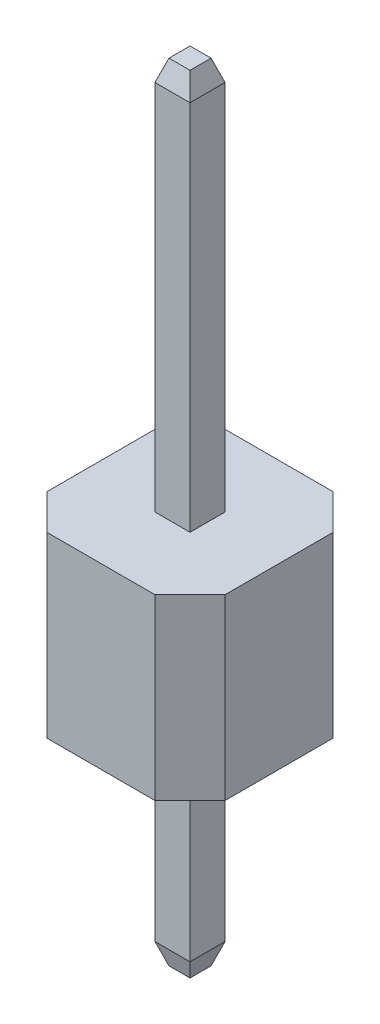
ISO-10303-21;
HEADER;
FILE_DESCRIPTION(('STEP AP214'),'2;1');
FILE_NAME('part.step','',(''),(''),'','','');
FILE_SCHEMA(('AUTOMOTIVE_DESIGN { 1 0 10303 214 1 1 1 1 }'));
ENDSEC;
DATA;
#1=APPLICATION_CONTEXT('core data for automotive mechanical design processes');
#2=APPLICATION_PROTOCOL_DEFINITION('international standard','automotive_design',2000,#1);
#3=PRODUCT_CONTEXT('',#1,'mechanical');
#4=PRODUCT('Part','Part','',(#3));
#5=PRODUCT_RELATED_PRODUCT_CATEGORY('part','',(#4));
#6=PRODUCT_DEFINITION_FORMATION('','',#4);
#7=PRODUCT_DEFINITION_CONTEXT('part definition',#1,'design');
#8=PRODUCT_DEFINITION('design','',#6,#7);
#9=PRODUCT_DEFINITION_SHAPE('','',#8);
#10=(LENGTH_UNIT() NAMED_UNIT(*) SI_UNIT(.MILLI.,.METRE.));
#11=(NAMED_UNIT(*) PLANE_ANGLE_UNIT() SI_UNIT($,.RADIAN.));
#12=(NAMED_UNIT(*) SI_UNIT($,.STERADIAN.) SOLID_ANGLE_UNIT());
#13=UNCERTAINTY_MEASURE_WITH_UNIT(LENGTH_MEASURE(1.E-05),#10,'distance_accuracy_value','');
#14=(GEOMETRIC_REPRESENTATION_CONTEXT(3) GLOBAL_UNCERTAINTY_ASSIGNED_CONTEXT((#13)) GLOBAL_UNIT_ASSIGNED_CONTEXT((#10,
#11,#12)) REPRESENTATION_CONTEXT('',''));
#15=CARTESIAN_POINT('',(0.,0.,0.));
#16=DIRECTION('',(0.,0.,1.));
#17=DIRECTION('',(1.,0.,0.));
#18=AXIS2_PLACEMENT_3D('',#15,#16,#17);
#19=CARTESIAN_POINT('',(1.27,0.,1.27));
#20=DIRECTION('',(0.,1.,0.));
#21=DIRECTION('',(1.,0.,0.));
#22=AXIS2_PLACEMENT_3D('',#19,#20,#21);
#23=PLANE('',#22);
#24=DIRECTION('',(-1.,0.,0.));
#25=VECTOR('',#24,1.);
#26=CARTESIAN_POINT('',(1.52,0.,1.52));
#27=LINE('',#26,#25);
#28=CARTESIAN_POINT('',(1.52,0.,1.52));
#29=VERTEX_POINT('',#28);
#30=CARTESIAN_POINT('',(1.02,0.,1.52));
#31=VERTEX_POINT('',#30);
#32=EDGE_CURVE('P0_E42',#29,#31,#27,.T.);
#33=ORIENTED_EDGE('',*,*,#32,.T.);
#34=DIRECTION('',(0.,0.,-1.));
#35=VECTOR('',#34,1.);
#36=CARTESIAN_POINT('',(1.02,0.,1.52));
#37=LINE('',#36,#35);
#38=CARTESIAN_POINT('',(1.02,0.,1.02));
#39=VERTEX_POINT('',#38);
#40=EDGE_CURVE('P0_E190',#31,#39,#37,.T.);
#41=ORIENTED_EDGE('',*,*,#40,.T.);
#42=DIRECTION('',(1.,0.,0.));
#43=VECTOR('',#42,1.);
#44=CARTESIAN_POINT('',(1.02,0.,1.02));
#45=LINE('',#44,#43);
#46=CARTESIAN_POINT('',(1.52,0.,1.02));
#47=VERTEX_POINT('',#46);
#48=EDGE_CURVE('P0_E196',#39,#47,#45,.T.);
#49=ORIENTED_EDGE('',*,*,#48,.T.);
#50=DIRECTION('',(0.,0.,1.));
#51=VECTOR('',#50,1.);
#52=CARTESIAN_POINT('',(1.52,0.,1.02));
#53=LINE('',#52,#51);
#54=EDGE_CURVE('P0_E214',#47,#29,#53,.T.);
#55=ORIENTED_EDGE('',*,*,#54,.T.);
#56=EDGE_LOOP('',(#33,#41,#49,#55));
#57=FACE_BOUND('',#56,.T.);
#58=DIRECTION('',(-0.707106781186548,0.,-0.707106781186548));
#59=VECTOR('',#58,1.);
#60=CARTESIAN_POINT('',(0.25,0.,2.29));
#61=LINE('',#60,#59);
#62=CARTESIAN_POINT('',(0.5,0.,2.54));
#63=VERTEX_POINT('',#62);
#64=CARTESIAN_POINT('',(0.,0.,2.04));
#65=VERTEX_POINT('',#64);
#66=EDGE_CURVE('P0_E184',#63,#65,#61,.T.);
#67=ORIENTED_EDGE('',*,*,#66,.F.);
#68=DIRECTION('',(-1.,0.,0.));
#69=VECTOR('',#68,1.);
#70=CARTESIAN_POINT('',(2.54,0.,2.54));
#71=LINE('',#70,#69);
#72=CARTESIAN_POINT('',(2.04,0.,2.54));
#73=VERTEX_POINT('',#72);
#74=EDGE_CURVE('P0_E162',#73,#63,#71,.T.);
#75=ORIENTED_EDGE('',*,*,#74,.F.);
#76=DIRECTION('',(-0.707106781186548,0.,0.707106781186548));
#77=VECTOR('',#76,1.);
#78=CARTESIAN_POINT('',(2.29,0.,2.29));
#79=LINE('',#78,#77);
#80=CARTESIAN_POINT('',(2.54,0.,2.04));
#81=VERTEX_POINT('',#80);
#82=EDGE_CURVE('P0_E199',#81,#73,#79,.T.);
#83=ORIENTED_EDGE('',*,*,#82,.F.);
#84=DIRECTION('',(0.,0.,1.));
#85=VECTOR('',#84,1.);
#86=CARTESIAN_POINT('',(2.54,0.,0.));
#87=LINE('',#86,#85);
#88=CARTESIAN_POINT('',(2.54,0.,0.5));
#89=VERTEX_POINT('',#88);
#90=EDGE_CURVE('P0_E28',#89,#81,#87,.T.);
#91=ORIENTED_EDGE('',*,*,#90,.F.);
#92=DIRECTION('',(0.707106781186548,0.,0.707106781186548));
#93=VECTOR('',#92,1.);
#94=CARTESIAN_POINT('',(2.29,0.,0.25));
#95=LINE('',#94,#93);
#96=CARTESIAN_POINT('',(2.04,0.,0.));
#97=VERTEX_POINT('',#96);
#98=EDGE_CURVE('P0_E177',#97,#89,#95,.T.);
#99=ORIENTED_EDGE('',*,*,#98,.F.);
#100=DIRECTION('',(1.,0.,0.));
#101=VECTOR('',#100,1.);
#102=CARTESIAN_POINT('',(0.,0.,0.));
#103=LINE('',#102,#101);
#104=CARTESIAN_POINT('',(0.5,0.,0.));
#105=VERTEX_POINT('',#104);
#106=EDGE_CURVE('P0_E220',#105,#97,#103,.T.);
#107=ORIENTED_EDGE('',*,*,#106,.F.);
#108=DIRECTION('',(0.707106781186548,0.,-0.707106781186548));
#109=VECTOR('',#108,1.);
#110=CARTESIAN_POINT('',(0.25,0.,0.25));
#111=LINE('',#110,#109);
#112=CARTESIAN_POINT('',(0.,0.,0.5));
#113=VERTEX_POINT('',#112);
#114=EDGE_CURVE('P0_E144',#113,#105,#111,.T.);
#115=ORIENTED_EDGE('',*,*,#114,.F.);
#116=DIRECTION('',(0.,0.,-1.));
#117=VECTOR('',#116,1.);
#118=CARTESIAN_POINT('',(0.,0.,2.54));
#119=LINE('',#118,#117);
#120=EDGE_CURVE('P0_E11',#65,#113,#119,.T.);
#121=ORIENTED_EDGE('',*,*,#120,.F.);
#122=EDGE_LOOP('',(#67,#75,#83,#91,#99,#107,#115,#121));
#123=FACE_BOUND('',#122,.T.);
#124=ADVANCED_FACE('P0_F17',(#57,#123),#23,.T.);
#125=CARTESIAN_POINT('',(0.,0.,2.54));
#126=DIRECTION('',(-1.,0.,0.));
#127=DIRECTION('',(0.,0.,1.));
#128=AXIS2_PLACEMENT_3D('',#125,#126,#127);
#129=PLANE('',#128);
#130=DIRECTION('',(0.,-1.,0.));
#131=VECTOR('',#130,1.);
#132=CARTESIAN_POINT('',(0.,0.,2.04));
#133=LINE('',#132,#131);
#134=CARTESIAN_POINT('',(0.,-2.54,2.04));
#135=VERTEX_POINT('',#134);
#136=EDGE_CURVE('P0_E187',#65,#135,#133,.T.);
#137=ORIENTED_EDGE('',*,*,#136,.F.);
#138=ORIENTED_EDGE('',*,*,#120,.T.);
#139=DIRECTION('',(0.,1.,0.));
#140=VECTOR('',#139,1.);
#141=CARTESIAN_POINT('',(0.,0.,0.5));
#142=LINE('',#141,#140);
#143=CARTESIAN_POINT('',(0.,-2.54,0.5));
#144=VERTEX_POINT('',#143);
#145=EDGE_CURVE('P0_E132',#144,#113,#142,.T.);
#146=ORIENTED_EDGE('',*,*,#145,.F.);
#147=DIRECTION('',(0.,0.,-1.));
#148=VECTOR('',#147,1.);
#149=CARTESIAN_POINT('',(0.,-2.54,2.54));
#150=LINE('',#149,#148);
#151=EDGE_CURVE('P0_E137',#135,#144,#150,.T.);
#152=ORIENTED_EDGE('',*,*,#151,.F.);
#153=EDGE_LOOP('',(#137,#138,#146,#152));
#154=FACE_BOUND('',#153,.T.);
#155=ADVANCED_FACE('P0_F135',(#154),#129,.T.);
#156=CARTESIAN_POINT('',(2.54,0.,0.));
#157=DIRECTION('',(1.,0.,0.));
#158=DIRECTION('',(0.,1.,0.));
#159=AXIS2_PLACEMENT_3D('',#156,#157,#158);
#160=PLANE('',#159);
#161=DIRECTION('',(0.,-1.,0.));
#162=VECTOR('',#161,1.);
#163=CARTESIAN_POINT('',(2.54,0.,0.5));
#164=LINE('',#163,#162);
#165=CARTESIAN_POINT('',(2.54,-2.54,0.5));
#166=VERTEX_POINT('',#165);
#167=EDGE_CURVE('P0_E120',#89,#166,#164,.T.);
#168=ORIENTED_EDGE('',*,*,#167,.F.);
#169=ORIENTED_EDGE('',*,*,#90,.T.);
#170=DIRECTION('',(0.,1.,0.));
#171=VECTOR('',#170,1.);
#172=CARTESIAN_POINT('',(2.54,0.,2.04));
#173=LINE('',#172,#171);
#174=CARTESIAN_POINT('',(2.54,-2.54,2.04));
#175=VERTEX_POINT('',#174);
#176=EDGE_CURVE('P0_E207',#175,#81,#173,.T.);
#177=ORIENTED_EDGE('',*,*,#176,.F.);
#178=DIRECTION('',(0.,0.,1.));
#179=VECTOR('',#178,1.);
#180=CARTESIAN_POINT('',(2.54,-2.54,0.));
#181=LINE('',#180,#179);
#182=EDGE_CURVE('P0_E172',#166,#175,#181,.T.);
#183=ORIENTED_EDGE('',*,*,#182,.F.);
#184=EDGE_LOOP('',(#168,#169,#177,#183));
#185=FACE_BOUND('',#184,.T.);
#186=ADVANCED_FACE('P0_F280',(#185),#160,.T.);
#187=CARTESIAN_POINT('',(1.02,0.,1.52));
#188=DIRECTION('',(0.,0.,-1.));
#189=DIRECTION('',(0.,-1.,0.));
#190=AXIS2_PLACEMENT_3D('',#187,#188,#189);
#191=PLANE('',#190);
#192=ORIENTED_EDGE('',*,*,#32,.F.);
#193=DIRECTION('',(0.,-1.,0.));
#194=VECTOR('',#193,1.);
#195=CARTESIAN_POINT('',(1.52,0.,1.52));
#196=LINE('',#195,#194);
#197=CARTESIAN_POINT('',(1.52,-2.54,1.52));
#198=VERTEX_POINT('',#197);
#199=EDGE_CURVE('P0_E217',#29,#198,#196,.T.);
#200=ORIENTED_EDGE('',*,*,#199,.T.);
#201=DIRECTION('',(1.,0.,0.));
#202=VECTOR('',#201,1.);
#203=CARTESIAN_POINT('',(1.52,-2.54,1.52));
#204=LINE('',#203,#202);
#205=CARTESIAN_POINT('',(1.02,-2.54,1.52));
#206=VERTEX_POINT('',#205);
#207=EDGE_CURVE('P0_E246',#206,#198,#204,.T.);
#208=ORIENTED_EDGE('',*,*,#207,.F.);
#209=DIRECTION('',(0.,-1.,0.));
#210=VECTOR('',#209,1.);
#211=CARTESIAN_POINT('',(1.02,0.,1.52));
#212=LINE('',#211,#210);
#213=EDGE_CURVE('P0_E188',#31,#206,#212,.T.);
#214=ORIENTED_EDGE('',*,*,#213,.F.);
#215=EDGE_LOOP('',(#192,#200,#208,#214));
#216=FACE_BOUND('',#215,.T.);
#217=ADVANCED_FACE('P0_F308',(#216),#191,.T.);
#218=CARTESIAN_POINT('',(1.52,0.,1.52));
#219=DIRECTION('',(-1.,0.,0.));
#220=DIRECTION('',(0.,0.,1.));
#221=AXIS2_PLACEMENT_3D('',#218,#219,#220);
#222=PLANE('',#221);
#223=ORIENTED_EDGE('',*,*,#54,.F.);
#224=DIRECTION('',(0.,-1.,0.));
#225=VECTOR('',#224,1.);
#226=CARTESIAN_POINT('',(1.52,0.,1.02));
#227=LINE('',#226,#225);
#228=CARTESIAN_POINT('',(1.52,-2.54,1.02));
#229=VERTEX_POINT('',#228);
#230=EDGE_CURVE('P0_E218',#47,#229,#227,.T.);
#231=ORIENTED_EDGE('',*,*,#230,.T.);
#232=DIRECTION('',(0.,0.,-1.));
#233=VECTOR('',#232,1.);
#234=CARTESIAN_POINT('',(1.52,-2.54,1.02));
#235=LINE('',#234,#233);
#236=EDGE_CURVE('P0_E238',#198,#229,#235,.T.);
#237=ORIENTED_EDGE('',*,*,#236,.F.);
#238=ORIENTED_EDGE('',*,*,#199,.F.);
#239=EDGE_LOOP('',(#223,#231,#237,#238));
#240=FACE_BOUND('',#239,.T.);
#241=ADVANCED_FACE('P0_F19',(#240),#222,.T.);
#242=CARTESIAN_POINT('',(1.52,0.,1.02));
#243=DIRECTION('',(0.,0.,1.));
#244=DIRECTION('',(1.,0.,0.));
#245=AXIS2_PLACEMENT_3D('',#242,#243,#244);
#246=PLANE('',#245);
#247=ORIENTED_EDGE('',*,*,#48,.F.);
#248=DIRECTION('',(0.,-1.,0.));
#249=VECTOR('',#248,1.);
#250=CARTESIAN_POINT('',(1.02,0.,1.02));
#251=LINE('',#250,#249);
#252=CARTESIAN_POINT('',(1.02,-2.54,1.02));
#253=VERTEX_POINT('',#252);
#254=EDGE_CURVE('P0_E21',#39,#253,#251,.T.);
#255=ORIENTED_EDGE('',*,*,#254,.T.);
#256=DIRECTION('',(-1.,0.,0.));
#257=VECTOR('',#256,1.);
#258=CARTESIAN_POINT('',(1.02,-2.54,1.02));
#259=LINE('',#258,#257);
#260=EDGE_CURVE('P0_E175',#229,#253,#259,.T.);
#261=ORIENTED_EDGE('',*,*,#260,.F.);
#262=ORIENTED_EDGE('',*,*,#230,.F.);
#263=EDGE_LOOP('',(#247,#255,#261,#262));
#264=FACE_BOUND('',#263,.T.);
#265=ADVANCED_FACE('P0_F316',(#264),#246,.T.);
#266=CARTESIAN_POINT('',(1.02,0.,1.02));
#267=DIRECTION('',(1.,0.,0.));
#268=DIRECTION('',(0.,1.,0.));
#269=AXIS2_PLACEMENT_3D('',#266,#267,#268);
#270=PLANE('',#269);
#271=ORIENTED_EDGE('',*,*,#40,.F.);
#272=ORIENTED_EDGE('',*,*,#213,.T.);
#273=DIRECTION('',(0.,0.,1.));
#274=VECTOR('',#273,1.);
#275=CARTESIAN_POINT('',(1.02,-2.54,1.52));
#276=LINE('',#275,#274);
#277=EDGE_CURVE('P0_E145',#253,#206,#276,.T.);
#278=ORIENTED_EDGE('',*,*,#277,.F.);
#279=ORIENTED_EDGE('',*,*,#254,.F.);
#280=EDGE_LOOP('',(#271,#272,#278,#279));
#281=FACE_BOUND('',#280,.T.);
#282=ADVANCED_FACE('P0_F314',(#281),#270,.T.);
#283=CARTESIAN_POINT('',(2.29,0.,2.29));
#284=DIRECTION('',(0.707106781186548,0.,0.707106781186548));
#285=DIRECTION('',(0.,-1.,0.));
#286=AXIS2_PLACEMENT_3D('',#283,#284,#285);
#287=PLANE('',#286);
#288=DIRECTION('',(0.707106781186548,0.,-0.707106781186548));
#289=VECTOR('',#288,1.);
#290=CARTESIAN_POINT('',(2.29,-2.54,2.29));
#291=LINE('',#290,#289);
#292=CARTESIAN_POINT('',(2.04,-2.54,2.54));
#293=VERTEX_POINT('',#292);
#294=EDGE_CURVE('P0_E252',#293,#175,#291,.T.);
#295=ORIENTED_EDGE('',*,*,#294,.T.);
#296=ORIENTED_EDGE('',*,*,#176,.T.);
#297=ORIENTED_EDGE('',*,*,#82,.T.);
#298=DIRECTION('',(0.,-1.,0.));
#299=VECTOR('',#298,1.);
#300=CARTESIAN_POINT('',(2.04,0.,2.54));
#301=LINE('',#300,#299);
#302=EDGE_CURVE('P0_E168',#73,#293,#301,.T.);
#303=ORIENTED_EDGE('',*,*,#302,.T.);
#304=EDGE_LOOP('',(#295,#296,#297,#303));
#305=FACE_BOUND('',#304,.T.);
#306=ADVANCED_FACE('P0_F268',(#305),#287,.T.);
#307=CARTESIAN_POINT('',(2.29,0.,0.25));
#308=DIRECTION('',(0.707106781186548,0.,-0.707106781186548));
#309=DIRECTION('',(0.,-1.,0.));
#310=AXIS2_PLACEMENT_3D('',#307,#308,#309);
#311=PLANE('',#310);
#312=DIRECTION('',(-0.707106781186548,0.,-0.707106781186548));
#313=VECTOR('',#312,1.);
#314=CARTESIAN_POINT('',(2.29,-2.54,0.25));
#315=LINE('',#314,#313);
#316=CARTESIAN_POINT('',(2.04,-2.54,0.));
#317=VERTEX_POINT('',#316);
#318=EDGE_CURVE('P0_E212',#166,#317,#315,.T.);
#319=ORIENTED_EDGE('',*,*,#318,.T.);
#320=DIRECTION('',(0.,1.,0.));
#321=VECTOR('',#320,1.);
#322=CARTESIAN_POINT('',(2.04,0.,0.));
#323=LINE('',#322,#321);
#324=EDGE_CURVE('P0_E109',#317,#97,#323,.T.);
#325=ORIENTED_EDGE('',*,*,#324,.T.);
#326=ORIENTED_EDGE('',*,*,#98,.T.);
#327=ORIENTED_EDGE('',*,*,#167,.T.);
#328=EDGE_LOOP('',(#319,#325,#326,#327));
#329=FACE_BOUND('',#328,.T.);
#330=ADVANCED_FACE('P0_F329',(#329),#311,.T.);
#331=CARTESIAN_POINT('',(0.,0.,0.));
#332=DIRECTION('',(0.,0.,-1.));
#333=DIRECTION('',(0.,-1.,0.));
#334=AXIS2_PLACEMENT_3D('',#331,#332,#333);
#335=PLANE('',#334);
#336=DIRECTION('',(0.,-1.,0.));
#337=VECTOR('',#336,1.);
#338=CARTESIAN_POINT('',(0.5,0.,0.));
#339=LINE('',#338,#337);
#340=CARTESIAN_POINT('',(0.5,-2.54,0.));
#341=VERTEX_POINT('',#340);
#342=EDGE_CURVE('P0_E151',#105,#341,#339,.T.);
#343=ORIENTED_EDGE('',*,*,#342,.F.);
#344=ORIENTED_EDGE('',*,*,#106,.T.);
#345=ORIENTED_EDGE('',*,*,#324,.F.);
#346=DIRECTION('',(1.,0.,0.));
#347=VECTOR('',#346,1.);
#348=CARTESIAN_POINT('',(0.,-2.54,0.));
#349=LINE('',#348,#347);
#350=EDGE_CURVE('P0_E155',#341,#317,#349,.T.);
#351=ORIENTED_EDGE('',*,*,#350,.F.);
#352=EDGE_LOOP('',(#343,#344,#345,#351));
#353=FACE_BOUND('',#352,.T.);
#354=ADVANCED_FACE('P0_F297',(#353),#335,.T.);
#355=CARTESIAN_POINT('',(0.25,0.,0.25));
#356=DIRECTION('',(-0.707106781186548,0.,-0.707106781186548));
#357=DIRECTION('',(-0.707106781186548,0.,0.707106781186548));
#358=AXIS2_PLACEMENT_3D('',#355,#356,#357);
#359=PLANE('',#358);
#360=DIRECTION('',(-0.707106781186548,0.,0.707106781186548));
#361=VECTOR('',#360,1.);
#362=CARTESIAN_POINT('',(0.25,-2.54,0.25));
#363=LINE('',#362,#361);
#364=EDGE_CURVE('P0_E148',#341,#144,#363,.T.);
#365=ORIENTED_EDGE('',*,*,#364,.T.);
#366=ORIENTED_EDGE('',*,*,#145,.T.);
#367=ORIENTED_EDGE('',*,*,#114,.T.);
#368=ORIENTED_EDGE('',*,*,#342,.T.);
#369=EDGE_LOOP('',(#365,#366,#367,#368));
#370=FACE_BOUND('',#369,.T.);
#371=ADVANCED_FACE('P0_F149',(#370),#359,.T.);
#372=CARTESIAN_POINT('',(1.27,-2.54,1.27));
#373=DIRECTION('',(0.,-1.,0.));
#374=DIRECTION('',(0.,0.,-1.));
#375=AXIS2_PLACEMENT_3D('',#372,#373,#374);
#376=PLANE('',#375);
#377=ORIENTED_EDGE('',*,*,#207,.T.);
#378=ORIENTED_EDGE('',*,*,#236,.T.);
#379=ORIENTED_EDGE('',*,*,#260,.T.);
#380=ORIENTED_EDGE('',*,*,#277,.T.);
#381=EDGE_LOOP('',(#377,#378,#379,#380));
#382=FACE_BOUND('',#381,.T.);
#383=DIRECTION('',(0.707106781186548,0.,0.707106781186548));
#384=VECTOR('',#383,1.);
#385=CARTESIAN_POINT('',(0.25,-2.54,2.29));
#386=LINE('',#385,#384);
#387=CARTESIAN_POINT('',(0.5,-2.54,2.54));
#388=VERTEX_POINT('',#387);
#389=EDGE_CURVE('P0_E160',#135,#388,#386,.T.);
#390=ORIENTED_EDGE('',*,*,#389,.F.);
#391=ORIENTED_EDGE('',*,*,#151,.T.);
#392=ORIENTED_EDGE('',*,*,#364,.F.);
#393=ORIENTED_EDGE('',*,*,#350,.T.);
#394=ORIENTED_EDGE('',*,*,#318,.F.);
#395=ORIENTED_EDGE('',*,*,#182,.T.);
#396=ORIENTED_EDGE('',*,*,#294,.F.);
#397=DIRECTION('',(-1.,0.,0.));
#398=VECTOR('',#397,1.);
#399=CARTESIAN_POINT('',(2.54,-2.54,2.54));
#400=LINE('',#399,#398);
#401=EDGE_CURVE('P0_E185',#293,#388,#400,.T.);
#402=ORIENTED_EDGE('',*,*,#401,.T.);
#403=EDGE_LOOP('',(#390,#391,#392,#393,#394,#395,#396,#402));
#404=FACE_BOUND('',#403,.T.);
#405=ADVANCED_FACE('P0_F158',(#382,#404),#376,.T.);
#406=CARTESIAN_POINT('',(2.54,0.,2.54));
#407=DIRECTION('',(0.,0.,1.));
#408=DIRECTION('',(1.,0.,0.));
#409=AXIS2_PLACEMENT_3D('',#406,#407,#408);
#410=PLANE('',#409);
#411=DIRECTION('',(0.,1.,0.));
#412=VECTOR('',#411,1.);
#413=CARTESIAN_POINT('',(0.5,0.,2.54));
#414=LINE('',#413,#412);
#415=EDGE_CURVE('P0_E180',#388,#63,#414,.T.);
#416=ORIENTED_EDGE('',*,*,#415,.F.);
#417=ORIENTED_EDGE('',*,*,#401,.F.);
#418=ORIENTED_EDGE('',*,*,#302,.F.);
#419=ORIENTED_EDGE('',*,*,#74,.T.);
#420=EDGE_LOOP('',(#416,#417,#418,#419));
#421=FACE_BOUND('',#420,.T.);
#422=ADVANCED_FACE('P0_F274',(#421),#410,.T.);
#423=CARTESIAN_POINT('',(0.25,0.,2.29));
#424=DIRECTION('',(-0.707106781186548,0.,0.707106781186548));
#425=DIRECTION('',(0.,1.,0.));
#426=AXIS2_PLACEMENT_3D('',#423,#424,#425);
#427=PLANE('',#426);
#428=ORIENTED_EDGE('',*,*,#389,.T.);
#429=ORIENTED_EDGE('',*,*,#415,.T.);
#430=ORIENTED_EDGE('',*,*,#66,.T.);
#431=ORIENTED_EDGE('',*,*,#136,.T.);
#432=EDGE_LOOP('',(#428,#429,#430,#431));
#433=FACE_BOUND('',#432,.T.);
#434=ADVANCED_FACE('P0_F286',(#433),#427,.T.);
#435=CLOSED_SHELL('',(#124,#155,#186,#217,#241,#265,#282,#306,#330,#354,#371,#405,#422,#434));
#436=MANIFOLD_SOLID_BREP('P0_B1',#435);
#437=CARTESIAN_POINT('',(1.02,0.,1.52));
#438=DIRECTION('',(0.,0.,1.));
#439=DIRECTION('',(1.,0.,0.));
#440=AXIS2_PLACEMENT_3D('',#437,#438,#439);
#441=PLANE('',#440);
#442=DIRECTION('',(-1.,0.,0.));
#443=VECTOR('',#442,1.);
#444=CARTESIAN_POINT('',(1.145,-5.3,1.52));
#445=LINE('',#444,#443);
#446=CARTESIAN_POINT('',(1.52,-5.3,1.52));
#447=VERTEX_POINT('',#446);
#448=CARTESIAN_POINT('',(1.02,-5.3,1.52));
#449=VERTEX_POINT('',#448);
#450=EDGE_CURVE('P1_E135',#447,#449,#445,.T.);
#451=ORIENTED_EDGE('',*,*,#450,.F.);
#452=DIRECTION('',(0.,1.,0.));
#453=VECTOR('',#452,1.);
#454=CARTESIAN_POINT('',(1.52,0.,1.52));
#455=LINE('',#454,#453);
#456=CARTESIAN_POINT('',(1.52,5.3,1.52));
#457=VERTEX_POINT('',#456);
#458=EDGE_CURVE('P1_E152',#447,#457,#455,.T.);
#459=ORIENTED_EDGE('',*,*,#458,.T.);
#460=DIRECTION('',(1.,0.,0.));
#461=VECTOR('',#460,1.);
#462=CARTESIAN_POINT('',(1.145,5.3,1.52));
#463=LINE('',#462,#461);
#464=CARTESIAN_POINT('',(1.02,5.3,1.52));
#465=VERTEX_POINT('',#464);
#466=EDGE_CURVE('P1_E181',#465,#457,#463,.T.);
#467=ORIENTED_EDGE('',*,*,#466,.F.);
#468=DIRECTION('',(0.,-1.,0.));
#469=VECTOR('',#468,1.);
#470=CARTESIAN_POINT('',(1.02,0.,1.52));
#471=LINE('',#470,#469);
#472=EDGE_CURVE('P1_E11',#465,#449,#471,.T.);
#473=ORIENTED_EDGE('',*,*,#472,.T.);
#474=EDGE_LOOP('',(#451,#459,#467,#473));
#475=FACE_BOUND('',#474,.T.);
#476=ADVANCED_FACE('P1_F17',(#475),#441,.T.);
#477=CARTESIAN_POINT('',(1.27,5.6,1.27));
#478=DIRECTION('',(0.,1.,0.));
#479=DIRECTION('',(1.,0.,0.));
#480=AXIS2_PLACEMENT_3D('',#477,#478,#479);
#481=PLANE('',#480);
#482=DIRECTION('',(1.,0.,0.));
#483=VECTOR('',#482,1.);
#484=CARTESIAN_POINT('',(1.395,5.6,1.12));
#485=LINE('',#484,#483);
#486=CARTESIAN_POINT('',(1.12,5.6,1.12));
#487=VERTEX_POINT('',#486);
#488=CARTESIAN_POINT('',(1.42,5.6,1.12));
#489=VERTEX_POINT('',#488);
#490=EDGE_CURVE('P1_E101',#487,#489,#485,.T.);
#491=ORIENTED_EDGE('',*,*,#490,.F.);
#492=DIRECTION('',(0.,0.,-1.));
#493=VECTOR('',#492,1.);
#494=CARTESIAN_POINT('',(1.12,5.6,1.145));
#495=LINE('',#494,#493);
#496=CARTESIAN_POINT('',(1.12,5.6,1.42));
#497=VERTEX_POINT('',#496);
#498=EDGE_CURVE('P1_E21',#497,#487,#495,.T.);
#499=ORIENTED_EDGE('',*,*,#498,.F.);
#500=DIRECTION('',(-1.,0.,0.));
#501=VECTOR('',#500,1.);
#502=CARTESIAN_POINT('',(1.145,5.6,1.42));
#503=LINE('',#502,#501);
#504=CARTESIAN_POINT('',(1.42,5.6,1.42));
#505=VERTEX_POINT('',#504);
#506=EDGE_CURVE('P1_E103',#505,#497,#503,.T.);
#507=ORIENTED_EDGE('',*,*,#506,.F.);
#508=DIRECTION('',(0.,0.,1.));
#509=VECTOR('',#508,1.);
#510=CARTESIAN_POINT('',(1.42,5.6,1.395));
#511=LINE('',#510,#509);
#512=EDGE_CURVE('P1_E97',#489,#505,#511,.T.);
#513=ORIENTED_EDGE('',*,*,#512,.F.);
#514=EDGE_LOOP('',(#491,#499,#507,#513));
#515=FACE_BOUND('',#514,.T.);
#516=ADVANCED_FACE('P1_F99',(#515),#481,.T.);
#517=CARTESIAN_POINT('',(1.02,0.,1.02));
#518=DIRECTION('',(-1.,0.,0.));
#519=DIRECTION('',(0.,0.,1.));
#520=AXIS2_PLACEMENT_3D('',#517,#518,#519);
#521=PLANE('',#520);
#522=DIRECTION('',(0.,0.,-1.));
#523=VECTOR('',#522,1.);
#524=CARTESIAN_POINT('',(1.02,-5.3,1.145));
#525=LINE('',#524,#523);
#526=CARTESIAN_POINT('',(1.02,-5.3,1.02));
#527=VERTEX_POINT('',#526);
#528=EDGE_CURVE('P1_E148',#449,#527,#525,.T.);
#529=ORIENTED_EDGE('',*,*,#528,.F.);
#530=ORIENTED_EDGE('',*,*,#472,.F.);
#531=DIRECTION('',(0.,0.,1.));
#532=VECTOR('',#531,1.);
#533=CARTESIAN_POINT('',(1.02,5.3,1.145));
#534=LINE('',#533,#532);
#535=CARTESIAN_POINT('',(1.02,5.3,1.02));
#536=VERTEX_POINT('',#535);
#537=EDGE_CURVE('P1_E187',#536,#465,#534,.T.);
#538=ORIENTED_EDGE('',*,*,#537,.F.);
#539=DIRECTION('',(0.,1.,0.));
#540=VECTOR('',#539,1.);
#541=CARTESIAN_POINT('',(1.02,0.,1.02));
#542=LINE('',#541,#540);
#543=EDGE_CURVE('P1_E131',#527,#536,#542,.T.);
#544=ORIENTED_EDGE('',*,*,#543,.F.);
#545=EDGE_LOOP('',(#529,#530,#538,#544));
#546=FACE_BOUND('',#545,.T.);
#547=ADVANCED_FACE('P1_F290',(#546),#521,.T.);
#548=CARTESIAN_POINT('',(1.07,5.45,1.145));
#549=DIRECTION('',(-0.948683298050514,0.316227766016838,0.));
#550=DIRECTION('',(0.,0.,1.));
#551=AXIS2_PLACEMENT_3D('',#548,#549,#550);
#552=PLANE('',#551);
#553=ORIENTED_EDGE('',*,*,#537,.T.);
#554=DIRECTION('',(-0.301511344578037,-0.904534033733109,0.301511344578037));
#555=VECTOR('',#554,1.);
#556=CARTESIAN_POINT('',(1.12,5.6,1.42));
#557=LINE('',#556,#555);
#558=EDGE_CURVE('P1_E156',#497,#465,#557,.T.);
#559=ORIENTED_EDGE('',*,*,#558,.F.);
#560=ORIENTED_EDGE('',*,*,#498,.T.);
#561=DIRECTION('',(-0.301511344578037,-0.904534033733109,-0.301511344578037));
#562=VECTOR('',#561,1.);
#563=CARTESIAN_POINT('',(1.12,5.6,1.12));
#564=LINE('',#563,#562);
#565=EDGE_CURVE('P1_E109',#487,#536,#564,.T.);
#566=ORIENTED_EDGE('',*,*,#565,.T.);
#567=EDGE_LOOP('',(#553,#559,#560,#566));
#568=FACE_BOUND('',#567,.T.);
#569=ADVANCED_FACE('P1_F301',(#568),#552,.T.);
#570=CARTESIAN_POINT('',(1.145,5.45,1.47));
#571=DIRECTION('',(0.,0.316227766016838,0.948683298050514));
#572=DIRECTION('',(1.,0.,0.));
#573=AXIS2_PLACEMENT_3D('',#570,#571,#572);
#574=PLANE('',#573);
#575=ORIENTED_EDGE('',*,*,#506,.T.);
#576=ORIENTED_EDGE('',*,*,#558,.T.);
#577=ORIENTED_EDGE('',*,*,#466,.T.);
#578=DIRECTION('',(0.301511344578037,-0.904534033733109,0.301511344578037));
#579=VECTOR('',#578,1.);
#580=CARTESIAN_POINT('',(1.42,5.6,1.42));
#581=LINE('',#580,#579);
#582=EDGE_CURVE('P1_E108',#505,#457,#581,.T.);
#583=ORIENTED_EDGE('',*,*,#582,.F.);
#584=EDGE_LOOP('',(#575,#576,#577,#583));
#585=FACE_BOUND('',#584,.T.);
#586=ADVANCED_FACE('P1_F194',(#585),#574,.T.);
#587=CARTESIAN_POINT('',(1.47,5.45,1.395));
#588=DIRECTION('',(0.948683298050514,0.316227766016838,0.));
#589=DIRECTION('',(0.,0.,-1.));
#590=AXIS2_PLACEMENT_3D('',#587,#588,#589);
#591=PLANE('',#590);
#592=ORIENTED_EDGE('',*,*,#512,.T.);
#593=ORIENTED_EDGE('',*,*,#582,.T.);
#594=DIRECTION('',(0.,0.,-1.));
#595=VECTOR('',#594,1.);
#596=CARTESIAN_POINT('',(1.52,5.3,1.395));
#597=LINE('',#596,#595);
#598=CARTESIAN_POINT('',(1.52,5.3,1.02));
#599=VERTEX_POINT('',#598);
#600=EDGE_CURVE('P1_E115',#457,#599,#597,.T.);
#601=ORIENTED_EDGE('',*,*,#600,.T.);
#602=DIRECTION('',(0.301511344578037,-0.904534033733109,-0.301511344578037));
#603=VECTOR('',#602,1.);
#604=CARTESIAN_POINT('',(1.42,5.6,1.12));
#605=LINE('',#604,#603);
#606=EDGE_CURVE('P1_E112',#489,#599,#605,.T.);
#607=ORIENTED_EDGE('',*,*,#606,.F.);
#608=EDGE_LOOP('',(#592,#593,#601,#607));
#609=FACE_BOUND('',#608,.T.);
#610=ADVANCED_FACE('P1_F113',(#609),#591,.T.);
#611=CARTESIAN_POINT('',(1.395,5.45,1.07));
#612=DIRECTION('',(0.,0.316227766016838,-0.948683298050514));
#613=DIRECTION('',(-1.,0.,0.));
#614=AXIS2_PLACEMENT_3D('',#611,#612,#613);
#615=PLANE('',#614);
#616=ORIENTED_EDGE('',*,*,#490,.T.);
#617=ORIENTED_EDGE('',*,*,#606,.T.);
#618=DIRECTION('',(-1.,0.,0.));
#619=VECTOR('',#618,1.);
#620=CARTESIAN_POINT('',(1.395,5.3,1.02));
#621=LINE('',#620,#619);
#622=EDGE_CURVE('P1_E126',#599,#536,#621,.T.);
#623=ORIENTED_EDGE('',*,*,#622,.T.);
#624=ORIENTED_EDGE('',*,*,#565,.F.);
#625=EDGE_LOOP('',(#616,#617,#623,#624));
#626=FACE_BOUND('',#625,.T.);
#627=ADVANCED_FACE('P1_F123',(#626),#615,.T.);
#628=CARTESIAN_POINT('',(1.27,-5.6,1.27));
#629=DIRECTION('',(0.,-1.,0.));
#630=DIRECTION('',(0.,0.,-1.));
#631=AXIS2_PLACEMENT_3D('',#628,#629,#630);
#632=PLANE('',#631);
#633=DIRECTION('',(-1.,0.,0.));
#634=VECTOR('',#633,1.);
#635=CARTESIAN_POINT('',(1.395,-5.6,1.12));
#636=LINE('',#635,#634);
#637=CARTESIAN_POINT('',(1.42,-5.6,1.12));
#638=VERTEX_POINT('',#637);
#639=CARTESIAN_POINT('',(1.12,-5.6,1.12));
#640=VERTEX_POINT('',#639);
#641=EDGE_CURVE('P1_E212',#638,#640,#636,.T.);
#642=ORIENTED_EDGE('',*,*,#641,.F.);
#643=DIRECTION('',(0.,0.,-1.));
#644=VECTOR('',#643,1.);
#645=CARTESIAN_POINT('',(1.42,-5.6,1.395));
#646=LINE('',#645,#644);
#647=CARTESIAN_POINT('',(1.42,-5.6,1.42));
#648=VERTEX_POINT('',#647);
#649=EDGE_CURVE('P1_E143',#648,#638,#646,.T.);
#650=ORIENTED_EDGE('',*,*,#649,.F.);
#651=DIRECTION('',(1.,0.,0.));
#652=VECTOR('',#651,1.);
#653=CARTESIAN_POINT('',(1.145,-5.6,1.42));
#654=LINE('',#653,#652);
#655=CARTESIAN_POINT('',(1.12,-5.6,1.42));
#656=VERTEX_POINT('',#655);
#657=EDGE_CURVE('P1_E169',#656,#648,#654,.T.);
#658=ORIENTED_EDGE('',*,*,#657,.F.);
#659=DIRECTION('',(0.,0.,1.));
#660=VECTOR('',#659,1.);
#661=CARTESIAN_POINT('',(1.12,-5.6,1.145));
#662=LINE('',#661,#660);
#663=EDGE_CURVE('P1_E149',#640,#656,#662,.T.);
#664=ORIENTED_EDGE('',*,*,#663,.F.);
#665=EDGE_LOOP('',(#642,#650,#658,#664));
#666=FACE_BOUND('',#665,.T.);
#667=ADVANCED_FACE('P1_F223',(#666),#632,.T.);
#668=CARTESIAN_POINT('',(1.52,0.,1.02));
#669=DIRECTION('',(0.,0.,-1.));
#670=DIRECTION('',(0.,-1.,0.));
#671=AXIS2_PLACEMENT_3D('',#668,#669,#670);
#672=PLANE('',#671);
#673=DIRECTION('',(1.,0.,0.));
#674=VECTOR('',#673,1.);
#675=CARTESIAN_POINT('',(1.395,-5.3,1.02));
#676=LINE('',#675,#674);
#677=CARTESIAN_POINT('',(1.52,-5.3,1.02));
#678=VERTEX_POINT('',#677);
#679=EDGE_CURVE('P1_E160',#527,#678,#676,.T.);
#680=ORIENTED_EDGE('',*,*,#679,.F.);
#681=ORIENTED_EDGE('',*,*,#543,.T.);
#682=ORIENTED_EDGE('',*,*,#622,.F.);
#683=DIRECTION('',(0.,1.,0.));
#684=VECTOR('',#683,1.);
#685=CARTESIAN_POINT('',(1.52,0.,1.02));
#686=LINE('',#685,#684);
#687=EDGE_CURVE('P1_E140',#678,#599,#686,.T.);
#688=ORIENTED_EDGE('',*,*,#687,.F.);
#689=EDGE_LOOP('',(#680,#681,#682,#688));
#690=FACE_BOUND('',#689,.T.);
#691=ADVANCED_FACE('P1_F230',(#690),#672,.T.);
#692=CARTESIAN_POINT('',(1.52,0.,1.52));
#693=DIRECTION('',(1.,0.,0.));
#694=DIRECTION('',(0.,1.,0.));
#695=AXIS2_PLACEMENT_3D('',#692,#693,#694);
#696=PLANE('',#695);
#697=DIRECTION('',(0.,0.,1.));
#698=VECTOR('',#697,1.);
#699=CARTESIAN_POINT('',(1.52,-5.3,1.395));
#700=LINE('',#699,#698);
#701=EDGE_CURVE('P1_E138',#678,#447,#700,.T.);
#702=ORIENTED_EDGE('',*,*,#701,.F.);
#703=ORIENTED_EDGE('',*,*,#687,.T.);
#704=ORIENTED_EDGE('',*,*,#600,.F.);
#705=ORIENTED_EDGE('',*,*,#458,.F.);
#706=EDGE_LOOP('',(#702,#703,#704,#705));
#707=FACE_BOUND('',#706,.T.);
#708=ADVANCED_FACE('P1_F204',(#707),#696,.T.);
#709=CARTESIAN_POINT('',(1.47,-5.45,1.395));
#710=DIRECTION('',(0.948683298050514,-0.316227766016838,0.));
#711=DIRECTION('',(0.,0.,-1.));
#712=AXIS2_PLACEMENT_3D('',#709,#710,#711);
#713=PLANE('',#712);
#714=ORIENTED_EDGE('',*,*,#701,.T.);
#715=DIRECTION('',(0.301511344578037,0.904534033733109,0.301511344578037));
#716=VECTOR('',#715,1.);
#717=CARTESIAN_POINT('',(1.42,-5.6,1.42));
#718=LINE('',#717,#716);
#719=EDGE_CURVE('P1_E139',#648,#447,#718,.T.);
#720=ORIENTED_EDGE('',*,*,#719,.F.);
#721=ORIENTED_EDGE('',*,*,#649,.T.);
#722=DIRECTION('',(0.301511344578037,0.904534033733109,-0.301511344578037));
#723=VECTOR('',#722,1.);
#724=CARTESIAN_POINT('',(1.42,-5.6,1.12));
#725=LINE('',#724,#723);
#726=EDGE_CURVE('P1_E164',#638,#678,#725,.T.);
#727=ORIENTED_EDGE('',*,*,#726,.T.);
#728=EDGE_LOOP('',(#714,#720,#721,#727));
#729=FACE_BOUND('',#728,.T.);
#730=ADVANCED_FACE('P1_F275',(#729),#713,.T.);
#731=CARTESIAN_POINT('',(1.145,-5.45,1.47));
#732=DIRECTION('',(0.,-0.316227766016838,0.948683298050514));
#733=DIRECTION('',(-1.,0.,0.));
#734=AXIS2_PLACEMENT_3D('',#731,#732,#733);
#735=PLANE('',#734);
#736=ORIENTED_EDGE('',*,*,#657,.T.);
#737=ORIENTED_EDGE('',*,*,#719,.T.);
#738=ORIENTED_EDGE('',*,*,#450,.T.);
#739=DIRECTION('',(-0.301511344578037,0.904534033733109,0.301511344578037));
#740=VECTOR('',#739,1.);
#741=CARTESIAN_POINT('',(1.12,-5.6,1.42));
#742=LINE('',#741,#740);
#743=EDGE_CURVE('P1_E144',#656,#449,#742,.T.);
#744=ORIENTED_EDGE('',*,*,#743,.F.);
#745=EDGE_LOOP('',(#736,#737,#738,#744));
#746=FACE_BOUND('',#745,.T.);
#747=ADVANCED_FACE('P1_F19',(#746),#735,.T.);
#748=CARTESIAN_POINT('',(1.07,-5.45,1.145));
#749=DIRECTION('',(-0.948683298050514,-0.316227766016838,0.));
#750=DIRECTION('',(-0.316227766016838,0.948683298050514,0.));
#751=AXIS2_PLACEMENT_3D('',#748,#749,#750);
#752=PLANE('',#751);
#753=ORIENTED_EDGE('',*,*,#663,.T.);
#754=ORIENTED_EDGE('',*,*,#743,.T.);
#755=ORIENTED_EDGE('',*,*,#528,.T.);
#756=DIRECTION('',(-0.301511344578037,0.904534033733109,-0.301511344578037));
#757=VECTOR('',#756,1.);
#758=CARTESIAN_POINT('',(1.12,-5.6,1.12));
#759=LINE('',#758,#757);
#760=EDGE_CURVE('P1_E165',#640,#527,#759,.T.);
#761=ORIENTED_EDGE('',*,*,#760,.F.);
#762=EDGE_LOOP('',(#753,#754,#755,#761));
#763=FACE_BOUND('',#762,.T.);
#764=ADVANCED_FACE('P1_F227',(#763),#752,.T.);
#765=CARTESIAN_POINT('',(1.395,-5.45,1.07));
#766=DIRECTION('',(0.,-0.316227766016838,-0.948683298050514));
#767=DIRECTION('',(0.,-0.948683298050514,0.316227766016838));
#768=AXIS2_PLACEMENT_3D('',#765,#766,#767);
#769=PLANE('',#768);
#770=ORIENTED_EDGE('',*,*,#641,.T.);
#771=ORIENTED_EDGE('',*,*,#760,.T.);
#772=ORIENTED_EDGE('',*,*,#679,.T.);
#773=ORIENTED_EDGE('',*,*,#726,.F.);
#774=EDGE_LOOP('',(#770,#771,#772,#773));
#775=FACE_BOUND('',#774,.T.);
#776=ADVANCED_FACE('P1_F221',(#775),#769,.T.);
#777=CLOSED_SHELL('',(#476,#516,#547,#569,#586,#610,#627,#667,#691,#708,#730,#747,#764,#776));
#778=MANIFOLD_SOLID_BREP('P1_B1',#777);
#779=ADVANCED_BREP_SHAPE_REPRESENTATION('',(#18,#436,#778),#14);
#780=SHAPE_DEFINITION_REPRESENTATION(#9,#779);
ENDSEC;
END-ISO-10303-21;
